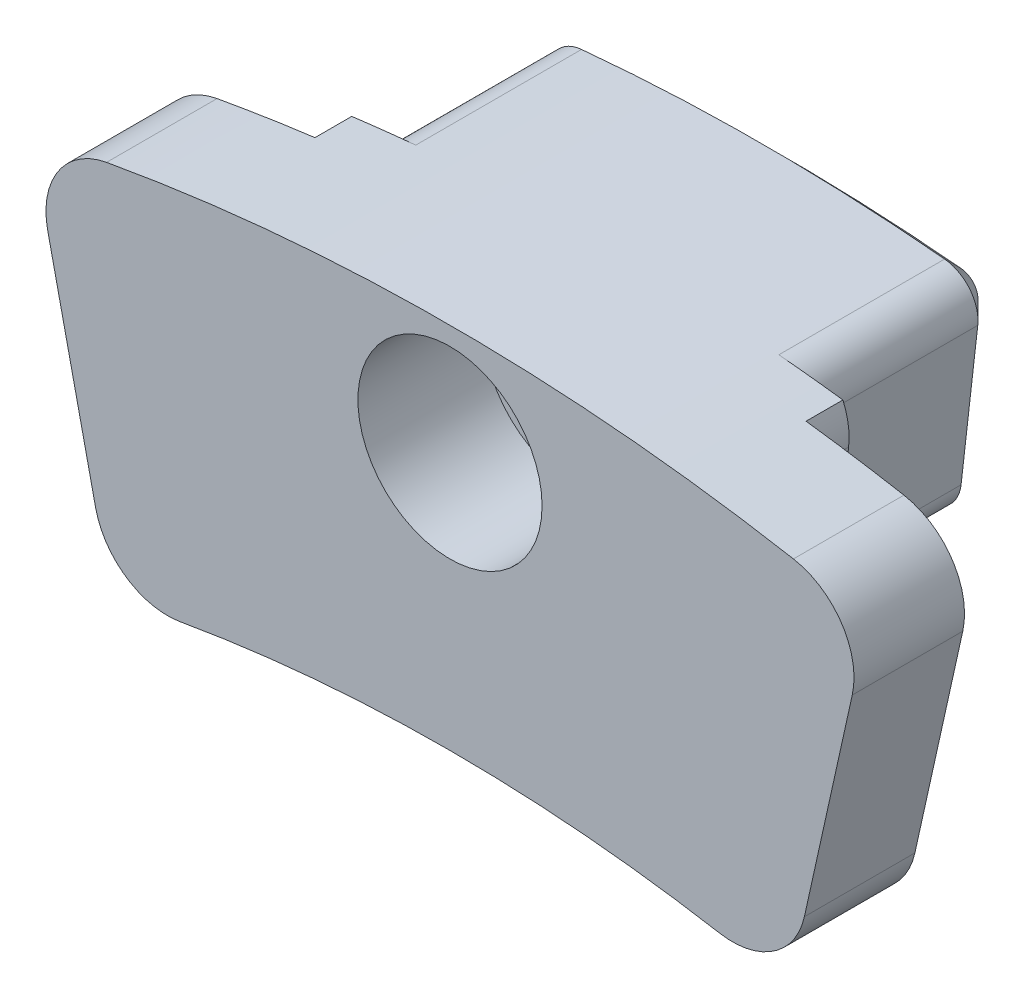
ISO-10303-21;
HEADER;
FILE_DESCRIPTION(('STEP AP214'),'2;1');
FILE_NAME('part.step','',(''),(''),'','','');
FILE_SCHEMA(('AUTOMOTIVE_DESIGN { 1 0 10303 214 1 1 1 1 }'));
ENDSEC;
DATA;
#1=APPLICATION_CONTEXT('core data for automotive mechanical design processes');
#2=APPLICATION_PROTOCOL_DEFINITION('international standard','automotive_design',2000,#1);
#3=PRODUCT_CONTEXT('',#1,'mechanical');
#4=PRODUCT('Part','Part','',(#3));
#5=PRODUCT_RELATED_PRODUCT_CATEGORY('part','',(#4));
#6=PRODUCT_DEFINITION_FORMATION('','',#4);
#7=PRODUCT_DEFINITION_CONTEXT('part definition',#1,'design');
#8=PRODUCT_DEFINITION('design','',#6,#7);
#9=PRODUCT_DEFINITION_SHAPE('','',#8);
#10=(LENGTH_UNIT() NAMED_UNIT(*) SI_UNIT(.MILLI.,.METRE.));
#11=(NAMED_UNIT(*) PLANE_ANGLE_UNIT() SI_UNIT($,.RADIAN.));
#12=(NAMED_UNIT(*) SI_UNIT($,.STERADIAN.) SOLID_ANGLE_UNIT());
#13=UNCERTAINTY_MEASURE_WITH_UNIT(LENGTH_MEASURE(1.E-05),#10,'distance_accuracy_value','');
#14=(GEOMETRIC_REPRESENTATION_CONTEXT(3) GLOBAL_UNCERTAINTY_ASSIGNED_CONTEXT((#13)) GLOBAL_UNIT_ASSIGNED_CONTEXT((#10,
#11,#12)) REPRESENTATION_CONTEXT('',''));
#15=CARTESIAN_POINT('',(0.,0.,0.));
#16=DIRECTION('',(0.,0.,1.));
#17=DIRECTION('',(1.,0.,0.));
#18=AXIS2_PLACEMENT_3D('',#15,#16,#17);
#19=CARTESIAN_POINT('',(0.,0.,6.));
#20=DIRECTION('',(0.,0.,1.));
#21=DIRECTION('',(1.,0.,0.));
#22=AXIS2_PLACEMENT_3D('',#19,#20,#21);
#23=PLANE('',#22);
#24=CARTESIAN_POINT('',(4.83529448942626,51.2725065429858,6.));
#25=DIRECTION('',(0.,0.,-1.));
#26=DIRECTION('',(-1.,0.,0.));
#27=AXIS2_PLACEMENT_3D('',#24,#25,#26);
#28=CIRCLE('',#27,1.99999999999999);
#29=CARTESIAN_POINT('',(6.66726855934589,52.0749222750986,6.));
#30=VERTEX_POINT('',#29);
#31=CARTESIAN_POINT('',(6.82243820077944,51.04610011545,6.));
#32=VERTEX_POINT('',#31);
#33=EDGE_CURVE('E480',#30,#32,#28,.T.);
#34=ORIENTED_EDGE('',*,*,#33,.F.);
#35=CARTESIAN_POINT('',(0.,0.,6.));
#36=DIRECTION('',(0.,0.,1.));
#37=DIRECTION('',(1.,0.,0.));
#38=AXIS2_PLACEMENT_3D('',#35,#36,#37);
#39=CIRCLE('',#38,52.5);
#40=CARTESIAN_POINT('',(9.32424249792701,51.6653510763244,6.));
#41=VERTEX_POINT('',#40);
#42=EDGE_CURVE('E271',#41,#30,#39,.T.);
#43=ORIENTED_EDGE('',*,*,#42,.F.);
#44=CARTESIAN_POINT('',(8.96903325991074,49.6971472257977,6.));
#45=DIRECTION('',(0.,0.,1.));
#46=DIRECTION('',(1.,0.,0.));
#47=AXIS2_PLACEMENT_3D('',#44,#45,#46);
#48=CIRCLE('',#47,2.);
#49=CARTESIAN_POINT('',(10.9216252741506,49.2642679979215,6.));
#50=VERTEX_POINT('',#49);
#51=EDGE_CURVE('E367',#41,#50,#48,.F.);
#52=ORIENTED_EDGE('',*,*,#51,.T.);
#53=DIRECTION('',(0.216439613938103,0.976296007119933,0.));
#54=VECTOR('',#53,1.);
#55=CARTESIAN_POINT('',(9.19868359236939,41.4925803025972,6.));
#56=LINE('',#55,#54);
#57=CARTESIAN_POINT('',(9.62183027985895,43.4012716641528,6.));
#58=VERTEX_POINT('',#57);
#59=EDGE_CURVE('E302',#58,#50,#56,.T.);
#60=ORIENTED_EDGE('',*,*,#59,.F.);
#61=CARTESIAN_POINT('',(7.66923826561909,43.834150892029,6.));
#62=DIRECTION('',(0.,0.,1.));
#63=DIRECTION('',(1.,0.,0.));
#64=AXIS2_PLACEMENT_3D('',#61,#62,#63);
#65=CIRCLE('',#64,2.);
#66=CARTESIAN_POINT('',(7.32455339974857,41.8640766946344,6.));
#67=VERTEX_POINT('',#66);
#68=EDGE_CURVE('E370',#58,#67,#65,.F.);
#69=ORIENTED_EDGE('',*,*,#68,.T.);
#70=CARTESIAN_POINT('',(0.,0.,6.));
#71=DIRECTION('',(0.,0.,-1.));
#72=DIRECTION('',(1.,0.,0.));
#73=AXIS2_PLACEMENT_3D('',#70,#71,#72);
#74=CIRCLE('',#73,42.5);
#75=CARTESIAN_POINT('',(-7.32455339974857,41.8640766946344,6.));
#76=VERTEX_POINT('',#75);
#77=EDGE_CURVE('E321',#76,#67,#74,.T.);
#78=ORIENTED_EDGE('',*,*,#77,.F.);
#79=CARTESIAN_POINT('',(-7.66923826561909,43.834150892029,6.));
#80=DIRECTION('',(0.,0.,1.));
#81=DIRECTION('',(1.,0.,0.));
#82=AXIS2_PLACEMENT_3D('',#79,#80,#81);
#83=CIRCLE('',#82,2.);
#84=CARTESIAN_POINT('',(-9.62183027985895,43.4012716641528,6.));
#85=VERTEX_POINT('',#84);
#86=EDGE_CURVE('E364',#76,#85,#83,.F.);
#87=ORIENTED_EDGE('',*,*,#86,.T.);
#88=DIRECTION('',(0.216439613938103,-0.976296007119933,0.));
#89=VECTOR('',#88,1.);
#90=CARTESIAN_POINT('',(-9.19868359236939,41.4925803025972,6.));
#91=LINE('',#90,#89);
#92=CARTESIAN_POINT('',(-10.9216252741506,49.2642679979215,6.));
#93=VERTEX_POINT('',#92);
#94=EDGE_CURVE('E317',#93,#85,#91,.T.);
#95=ORIENTED_EDGE('',*,*,#94,.F.);
#96=CARTESIAN_POINT('',(-8.96903325991074,49.6971472257977,6.));
#97=DIRECTION('',(0.,0.,1.));
#98=DIRECTION('',(1.,0.,0.));
#99=AXIS2_PLACEMENT_3D('',#96,#97,#98);
#100=CIRCLE('',#99,2.);
#101=CARTESIAN_POINT('',(-9.32424249792701,51.6653510763244,6.));
#102=VERTEX_POINT('',#101);
#103=EDGE_CURVE('E360',#93,#102,#100,.F.);
#104=ORIENTED_EDGE('',*,*,#103,.T.);
#105=CARTESIAN_POINT('',(-6.66726855934591,52.0749222750986,6.));
#106=VERTEX_POINT('',#105);
#107=EDGE_CURVE('E296',#106,#102,#39,.T.);
#108=ORIENTED_EDGE('',*,*,#107,.F.);
#109=CARTESIAN_POINT('',(-4.83529448942626,51.2725065429858,6.));
#110=DIRECTION('',(0.,0.,-1.));
#111=DIRECTION('',(-1.,0.,0.));
#112=AXIS2_PLACEMENT_3D('',#109,#110,#111);
#113=CIRCLE('',#112,2.);
#114=CARTESIAN_POINT('',(-6.82243820077944,51.04610011545,6.));
#115=VERTEX_POINT('',#114);
#116=EDGE_CURVE('E265',#115,#106,#113,.T.);
#117=ORIENTED_EDGE('',*,*,#116,.F.);
#118=DIRECTION('',(-0.113203213767908,0.993571855676587,0.));
#119=VECTOR('',#118,1.);
#120=CARTESIAN_POINT('',(-6.36953276481174,47.0710001206474,6.));
#121=LINE('',#120,#119);
#122=CARTESIAN_POINT('',(-6.36953276481174,47.0710001206474,6.));
#123=VERTEX_POINT('',#122);
#124=EDGE_CURVE('E504',#123,#115,#121,.T.);
#125=ORIENTED_EDGE('',*,*,#124,.F.);
#126=CARTESIAN_POINT('',(-4.38238905345856,47.2974065481832,6.));
#127=DIRECTION('',(0.,0.,-1.));
#128=DIRECTION('',(-1.,0.,0.));
#129=AXIS2_PLACEMENT_3D('',#126,#127,#128);
#130=CIRCLE('',#129,2.);
#131=CARTESIAN_POINT('',(-4.1978674091024,45.305936798786,6.));
#132=VERTEX_POINT('',#131);
#133=EDGE_CURVE('E501',#132,#123,#130,.T.);
#134=ORIENTED_EDGE('',*,*,#133,.F.);
#135=CARTESIAN_POINT('',(0.,0.,6.));
#136=DIRECTION('',(0.,0.,1.));
#137=DIRECTION('',(-1.,0.,0.));
#138=AXIS2_PLACEMENT_3D('',#135,#136,#137);
#139=CIRCLE('',#138,45.5);
#140=CARTESIAN_POINT('',(4.19786740910241,45.305936798786,6.));
#141=VERTEX_POINT('',#140);
#142=EDGE_CURVE('E498',#141,#132,#139,.T.);
#143=ORIENTED_EDGE('',*,*,#142,.F.);
#144=CARTESIAN_POINT('',(4.38238905345856,47.2974065481832,6.));
#145=DIRECTION('',(0.,0.,-1.));
#146=DIRECTION('',(-1.,0.,0.));
#147=AXIS2_PLACEMENT_3D('',#144,#145,#146);
#148=CIRCLE('',#147,2.);
#149=CARTESIAN_POINT('',(6.36953276481174,47.0710001206474,6.));
#150=VERTEX_POINT('',#149);
#151=EDGE_CURVE('E491',#150,#141,#148,.T.);
#152=ORIENTED_EDGE('',*,*,#151,.F.);
#153=DIRECTION('',(-0.113203213767906,-0.993571855676587,0.));
#154=VECTOR('',#153,1.);
#155=CARTESIAN_POINT('',(6.82243820077944,51.04610011545,6.));
#156=LINE('',#155,#154);
#157=EDGE_CURVE('E487',#32,#150,#156,.T.);
#158=ORIENTED_EDGE('',*,*,#157,.F.);
#159=EDGE_LOOP('',(#34,#43,#52,#60,#69,#78,#87,#95,#104,#108,#117,#125,#134,#143,#152,#158));
#160=FACE_BOUND('',#159,.T.);
#161=ADVANCED_FACE('F54',(#160),#23,.F.);
#162=CARTESIAN_POINT('',(0.,0.,6.));
#163=DIRECTION('',(0.,0.,-1.));
#164=DIRECTION('',(-1.,0.,0.));
#165=AXIS2_PLACEMENT_3D('',#162,#163,#164);
#166=CYLINDRICAL_SURFACE('',#165,52.5);
#167=DIRECTION('',(0.,0.,-1.));
#168=VECTOR('',#167,1.);
#169=CARTESIAN_POINT('',(4.92918370281318,52.268089194306,6.));
#170=LINE('',#169,#168);
#171=CARTESIAN_POINT('',(4.92918370281318,52.2680891943059,5.));
#172=VERTEX_POINT('',#171);
#173=CARTESIAN_POINT('',(4.92918370281318,52.268089194306,0.500000000000007));
#174=VERTEX_POINT('',#173);
#175=EDGE_CURVE('E350',#172,#174,#170,.T.);
#176=ORIENTED_EDGE('',*,*,#175,.T.);
#177=CARTESIAN_POINT('',(0.,0.,0.500000000000007));
#178=DIRECTION('',(0.,0.,1.));
#179=DIRECTION('',(1.,0.,0.));
#180=AXIS2_PLACEMENT_3D('',#177,#178,#179);
#181=CIRCLE('',#180,52.5);
#182=CARTESIAN_POINT('',(-4.92918370281318,52.268089194306,0.500000000000007));
#183=VERTEX_POINT('',#182);
#184=EDGE_CURVE('E405',#174,#183,#181,.T.);
#185=ORIENTED_EDGE('',*,*,#184,.T.);
#186=DIRECTION('',(0.,0.,-1.));
#187=VECTOR('',#186,1.);
#188=CARTESIAN_POINT('',(-4.92918370281318,52.268089194306,6.));
#189=LINE('',#188,#187);
#190=CARTESIAN_POINT('',(-4.92918370281318,52.2680891943059,5.));
#191=VERTEX_POINT('',#190);
#192=EDGE_CURVE('E347',#183,#191,#189,.F.);
#193=ORIENTED_EDGE('',*,*,#192,.T.);
#194=CARTESIAN_POINT('',(0.,0.,5.));
#195=DIRECTION('',(0.,0.,-1.));
#196=DIRECTION('',(-1.,0.,0.));
#197=AXIS2_PLACEMENT_3D('',#194,#195,#196);
#198=CIRCLE('',#197,52.5);
#199=CARTESIAN_POINT('',(-6.66726855934591,52.0749222750986,5.));
#200=VERTEX_POINT('',#199);
#201=EDGE_CURVE('E568',#200,#191,#198,.T.);
#202=ORIENTED_EDGE('',*,*,#201,.F.);
#203=DIRECTION('',(0.,0.,1.));
#204=VECTOR('',#203,1.);
#205=CARTESIAN_POINT('',(-6.66726855934591,52.0749222750986,5.));
#206=LINE('',#205,#204);
#207=EDGE_CURVE('E510',#200,#106,#206,.T.);
#208=ORIENTED_EDGE('',*,*,#207,.T.);
#209=ORIENTED_EDGE('',*,*,#107,.T.);
#210=DIRECTION('',(0.,0.,-1.));
#211=VECTOR('',#210,1.);
#212=CARTESIAN_POINT('',(-9.32424249792701,51.6653510763244,6.));
#213=LINE('',#212,#211);
#214=CARTESIAN_POINT('',(-9.32424249792701,51.6653510763244,9.));
#215=VERTEX_POINT('',#214);
#216=EDGE_CURVE('E392',#102,#215,#213,.F.);
#217=ORIENTED_EDGE('',*,*,#216,.T.);
#218=CARTESIAN_POINT('',(0.,0.,9.));
#219=DIRECTION('',(0.,0.,1.));
#220=DIRECTION('',(1.,0.,0.));
#221=AXIS2_PLACEMENT_3D('',#218,#219,#220);
#222=CIRCLE('',#221,52.5);
#223=CARTESIAN_POINT('',(9.32424249792701,51.6653510763244,9.));
#224=VERTEX_POINT('',#223);
#225=EDGE_CURVE('E297',#224,#215,#222,.T.);
#226=ORIENTED_EDGE('',*,*,#225,.F.);
#227=DIRECTION('',(0.,0.,-1.));
#228=VECTOR('',#227,1.);
#229=CARTESIAN_POINT('',(9.32424249792701,51.6653510763244,6.));
#230=LINE('',#229,#228);
#231=EDGE_CURVE('E395',#224,#41,#230,.T.);
#232=ORIENTED_EDGE('',*,*,#231,.T.);
#233=ORIENTED_EDGE('',*,*,#42,.T.);
#234=DIRECTION('',(0.,0.,1.));
#235=VECTOR('',#234,1.);
#236=CARTESIAN_POINT('',(6.66726855934589,52.0749222750986,5.));
#237=LINE('',#236,#235);
#238=CARTESIAN_POINT('',(6.66726855934589,52.0749222750986,5.));
#239=VERTEX_POINT('',#238);
#240=EDGE_CURVE('E246',#239,#30,#237,.T.);
#241=ORIENTED_EDGE('',*,*,#240,.F.);
#242=CARTESIAN_POINT('',(0.,0.,5.));
#243=DIRECTION('',(0.,0.,-1.));
#244=DIRECTION('',(-1.,0.,0.));
#245=AXIS2_PLACEMENT_3D('',#242,#243,#244);
#246=CIRCLE('',#245,52.5);
#247=EDGE_CURVE('E254',#172,#239,#246,.T.);
#248=ORIENTED_EDGE('',*,*,#247,.F.);
#249=EDGE_LOOP('',(#176,#185,#193,#202,#208,#209,#217,#226,#232,#233,#241,#248));
#250=FACE_BOUND('',#249,.T.);
#251=ADVANCED_FACE('F268',(#250),#166,.T.);
#252=CARTESIAN_POINT('',(-5.26394944020767,46.2010912889613,6.));
#253=DIRECTION('',(0.993571855676587,0.113203213767907,0.));
#254=DIRECTION('',(-0.113203213767907,0.993571855676587,0.));
#255=AXIS2_PLACEMENT_3D('',#252,#253,#254);
#256=PLANE('',#255);
#257=DIRECTION('',(0.,0.,-1.));
#258=VECTOR('',#257,1.);
#259=CARTESIAN_POINT('',(-5.82886634510285,51.1593033292179,6.));
#260=LINE('',#259,#258);
#261=CARTESIAN_POINT('',(-5.82886634510285,51.1593033292179,5.));
#262=VERTEX_POINT('',#261);
#263=CARTESIAN_POINT('',(-5.82886634510285,51.1593033292179,0.500000000000007));
#264=VERTEX_POINT('',#263);
#265=EDGE_CURVE('E333',#262,#264,#260,.T.);
#266=ORIENTED_EDGE('',*,*,#265,.T.);
#267=DIRECTION('',(0.113203213767907,-0.993571855676587,0.));
#268=VECTOR('',#267,1.);
#269=CARTESIAN_POINT('',(-5.26394944020767,46.2010912889613,0.500000000000007));
#270=LINE('',#269,#268);
#271=CARTESIAN_POINT('',(-5.37596090913515,47.1842033344153,0.500000000000007));
#272=VERTEX_POINT('',#271);
#273=EDGE_CURVE('E440',#264,#272,#270,.T.);
#274=ORIENTED_EDGE('',*,*,#273,.T.);
#275=DIRECTION('',(0.,0.,-1.));
#276=VECTOR('',#275,1.);
#277=CARTESIAN_POINT('',(-5.37596090913515,47.1842033344153,6.));
#278=LINE('',#277,#276);
#279=CARTESIAN_POINT('',(-5.37596090913515,47.1842033344153,5.));
#280=VERTEX_POINT('',#279);
#281=EDGE_CURVE('E337',#272,#280,#278,.F.);
#282=ORIENTED_EDGE('',*,*,#281,.T.);
#283=DIRECTION('',(0.113203213767907,-0.993571855676587,0.));
#284=VECTOR('',#283,1.);
#285=CARTESIAN_POINT('',(-5.82886634510285,51.1593033292179,5.));
#286=LINE('',#285,#284);
#287=EDGE_CURVE('E575',#262,#280,#286,.T.);
#288=ORIENTED_EDGE('',*,*,#287,.F.);
#289=EDGE_LOOP('',(#266,#274,#282,#288));
#290=FACE_BOUND('',#289,.T.);
#291=ADVANCED_FACE('F629',(#290),#256,.F.);
#292=CARTESIAN_POINT('',(0.,0.,6.));
#293=DIRECTION('',(0.,0.,-1.));
#294=DIRECTION('',(-1.,0.,0.));
#295=AXIS2_PLACEMENT_3D('',#292,#293,#294);
#296=CYLINDRICAL_SURFACE('',#295,46.5);
#297=DIRECTION('',(0.,0.,-1.));
#298=VECTOR('',#297,1.);
#299=CARTESIAN_POINT('',(-4.29012823128049,46.3016716734846,6.));
#300=LINE('',#299,#298);
#301=CARTESIAN_POINT('',(-4.29012823128048,46.3016716734846,5.));
#302=VERTEX_POINT('',#301);
#303=CARTESIAN_POINT('',(-4.29012823128049,46.3016716734846,0.500000000000007));
#304=VERTEX_POINT('',#303);
#305=EDGE_CURVE('E330',#302,#304,#300,.T.);
#306=ORIENTED_EDGE('',*,*,#305,.T.);
#307=CARTESIAN_POINT('',(0.,0.,0.500000000000007));
#308=DIRECTION('',(0.,0.,1.));
#309=DIRECTION('',(1.,0.,0.));
#310=AXIS2_PLACEMENT_3D('',#307,#308,#309);
#311=CIRCLE('',#310,46.5);
#312=CARTESIAN_POINT('',(4.29012823128049,46.3016716734846,0.500000000000007));
#313=VERTEX_POINT('',#312);
#314=EDGE_CURVE('E13',#304,#313,#311,.F.);
#315=ORIENTED_EDGE('',*,*,#314,.T.);
#316=DIRECTION('',(0.,0.,-1.));
#317=VECTOR('',#316,1.);
#318=CARTESIAN_POINT('',(4.29012823128049,46.3016716734846,6.));
#319=LINE('',#318,#317);
#320=CARTESIAN_POINT('',(4.29012823128049,46.3016716734846,5.));
#321=VERTEX_POINT('',#320);
#322=EDGE_CURVE('E314',#313,#321,#319,.F.);
#323=ORIENTED_EDGE('',*,*,#322,.T.);
#324=CARTESIAN_POINT('',(0.,0.,5.));
#325=DIRECTION('',(0.,0.,-1.));
#326=DIRECTION('',(-1.,0.,0.));
#327=AXIS2_PLACEMENT_3D('',#324,#325,#326);
#328=CIRCLE('',#327,46.5);
#329=EDGE_CURVE('E582',#302,#321,#328,.T.);
#330=ORIENTED_EDGE('',*,*,#329,.F.);
#331=EDGE_LOOP('',(#306,#315,#323,#330));
#332=FACE_BOUND('',#331,.T.);
#333=ADVANCED_FACE('F685',(#332),#296,.F.);
#334=CARTESIAN_POINT('',(5.26394944020767,46.2010912889613,6.));
#335=DIRECTION('',(-0.993571855676587,0.113203213767907,0.));
#336=DIRECTION('',(-0.113203213767907,-0.993571855676587,0.));
#337=AXIS2_PLACEMENT_3D('',#334,#335,#336);
#338=PLANE('',#337);
#339=DIRECTION('',(0.,0.,-1.));
#340=VECTOR('',#339,1.);
#341=CARTESIAN_POINT('',(5.37596090913515,47.1842033344153,6.));
#342=LINE('',#341,#340);
#343=CARTESIAN_POINT('',(5.37596090913515,47.1842033344153,5.));
#344=VERTEX_POINT('',#343);
#345=CARTESIAN_POINT('',(5.37596090913515,47.1842033344153,0.500000000000007));
#346=VERTEX_POINT('',#345);
#347=EDGE_CURVE('E343',#344,#346,#342,.T.);
#348=ORIENTED_EDGE('',*,*,#347,.T.);
#349=DIRECTION('',(0.113203213767907,0.993571855676587,0.));
#350=VECTOR('',#349,1.);
#351=CARTESIAN_POINT('',(5.26394944020767,46.2010912889613,0.500000000000007));
#352=LINE('',#351,#350);
#353=CARTESIAN_POINT('',(5.82886634510285,51.1593033292179,0.500000000000007));
#354=VERTEX_POINT('',#353);
#355=EDGE_CURVE('E443',#346,#354,#352,.T.);
#356=ORIENTED_EDGE('',*,*,#355,.T.);
#357=DIRECTION('',(0.,0.,-1.));
#358=VECTOR('',#357,1.);
#359=CARTESIAN_POINT('',(5.82886634510285,51.1593033292179,6.));
#360=LINE('',#359,#358);
#361=CARTESIAN_POINT('',(5.82886634510286,51.1593033292179,5.));
#362=VERTEX_POINT('',#361);
#363=EDGE_CURVE('E340',#354,#362,#360,.F.);
#364=ORIENTED_EDGE('',*,*,#363,.T.);
#365=DIRECTION('',(0.113203213767907,0.993571855676587,0.));
#366=VECTOR('',#365,1.);
#367=CARTESIAN_POINT('',(5.37596090913515,47.1842033344153,5.));
#368=LINE('',#367,#366);
#369=EDGE_CURVE('E588',#344,#362,#368,.T.);
#370=ORIENTED_EDGE('',*,*,#369,.F.);
#371=EDGE_LOOP('',(#348,#356,#364,#370));
#372=FACE_BOUND('',#371,.T.);
#373=ADVANCED_FACE('F645',(#372),#338,.F.);
#374=CARTESIAN_POINT('',(0.,0.,0.));
#375=DIRECTION('',(0.,0.,1.));
#376=DIRECTION('',(1.,0.,0.));
#377=AXIS2_PLACEMENT_3D('',#374,#375,#376);
#378=PLANE('',#377);
#379=CARTESIAN_POINT('',(-4.83529448942626,51.2725065429858,0.));
#380=DIRECTION('',(0.,0.,1.));
#381=DIRECTION('',(1.,0.,0.));
#382=AXIS2_PLACEMENT_3D('',#379,#380,#381);
#383=CIRCLE('',#382,0.500000000000002);
#384=CARTESIAN_POINT('',(-5.33208041726455,51.2159049361019,0.));
#385=VERTEX_POINT('',#384);
#386=CARTESIAN_POINT('',(-4.88223909611972,51.7702978686459,0.));
#387=VERTEX_POINT('',#386);
#388=EDGE_CURVE('E427',#385,#387,#383,.F.);
#389=ORIENTED_EDGE('',*,*,#388,.T.);
#390=CARTESIAN_POINT('',(0.,0.,0.));
#391=DIRECTION('',(0.,0.,1.));
#392=DIRECTION('',(1.,0.,0.));
#393=AXIS2_PLACEMENT_3D('',#390,#391,#392);
#394=CIRCLE('',#393,52.);
#395=CARTESIAN_POINT('',(4.88223909611972,51.7702978686459,0.));
#396=VERTEX_POINT('',#395);
#397=EDGE_CURVE('E430',#387,#396,#394,.F.);
#398=ORIENTED_EDGE('',*,*,#397,.T.);
#399=CARTESIAN_POINT('',(4.83529448942626,51.2725065429858,0.));
#400=DIRECTION('',(0.,0.,1.));
#401=DIRECTION('',(1.,0.,0.));
#402=AXIS2_PLACEMENT_3D('',#399,#400,#401);
#403=CIRCLE('',#402,0.499999999999999);
#404=CARTESIAN_POINT('',(5.33208041726455,51.2159049361019,0.));
#405=VERTEX_POINT('',#404);
#406=EDGE_CURVE('E424',#396,#405,#403,.F.);
#407=ORIENTED_EDGE('',*,*,#406,.T.);
#408=DIRECTION('',(-0.113203213767907,-0.993571855676587,0.));
#409=VECTOR('',#408,1.);
#410=CARTESIAN_POINT('',(-0.496785927838296,0.0566016068839537,0.));
#411=LINE('',#410,#409);
#412=CARTESIAN_POINT('',(4.87917498129685,47.2408049412993,0.));
#413=VERTEX_POINT('',#412);
#414=EDGE_CURVE('E418',#405,#413,#411,.T.);
#415=ORIENTED_EDGE('',*,*,#414,.T.);
#416=CARTESIAN_POINT('',(4.38238905345856,47.2974065481832,0.));
#417=DIRECTION('',(0.,0.,1.));
#418=DIRECTION('',(1.,0.,0.));
#419=AXIS2_PLACEMENT_3D('',#416,#417,#418);
#420=CIRCLE('',#419,0.499999999999997);
#421=CARTESIAN_POINT('',(4.33625864236952,46.7995391108339,0.));
#422=VERTEX_POINT('',#421);
#423=EDGE_CURVE('E412',#413,#422,#420,.F.);
#424=ORIENTED_EDGE('',*,*,#423,.T.);
#425=CARTESIAN_POINT('',(0.,0.,0.));
#426=DIRECTION('',(0.,0.,1.));
#427=DIRECTION('',(1.,0.,0.));
#428=AXIS2_PLACEMENT_3D('',#425,#426,#427);
#429=CIRCLE('',#428,47.);
#430=CARTESIAN_POINT('',(-4.33625864236952,46.7995391108339,0.));
#431=VERTEX_POINT('',#430);
#432=EDGE_CURVE('E409',#422,#431,#429,.T.);
#433=ORIENTED_EDGE('',*,*,#432,.T.);
#434=CARTESIAN_POINT('',(-4.38238905345856,47.2974065481832,0.));
#435=DIRECTION('',(0.,0.,1.));
#436=DIRECTION('',(1.,0.,0.));
#437=AXIS2_PLACEMENT_3D('',#434,#435,#436);
#438=CIRCLE('',#437,0.499999999999999);
#439=CARTESIAN_POINT('',(-4.87917498129686,47.2408049412993,0.));
#440=VERTEX_POINT('',#439);
#441=EDGE_CURVE('E415',#431,#440,#438,.F.);
#442=ORIENTED_EDGE('',*,*,#441,.T.);
#443=DIRECTION('',(-0.113203213767907,0.993571855676587,0.));
#444=VECTOR('',#443,1.);
#445=CARTESIAN_POINT('',(0.496785927838295,0.0566016068839536,0.));
#446=LINE('',#445,#444);
#447=EDGE_CURVE('E421',#440,#385,#446,.T.);
#448=ORIENTED_EDGE('',*,*,#447,.T.);
#449=EDGE_LOOP('',(#389,#398,#407,#415,#424,#433,#442,#448));
#450=FACE_BOUND('',#449,.T.);
#451=CARTESIAN_POINT('',(0.,49.5,0.));
#452=DIRECTION('',(0.,0.,1.));
#453=DIRECTION('',(1.,0.,0.));
#454=AXIS2_PLACEMENT_3D('',#451,#452,#453);
#455=CIRCLE('',#454,1.7);
#456=CARTESIAN_POINT('',(1.7,49.5,0.));
#457=VERTEX_POINT('',#456);
#458=EDGE_CURVE('E292',#457,#457,#455,.T.);
#459=ORIENTED_EDGE('',*,*,#458,.T.);
#460=EDGE_LOOP('',(#459));
#461=FACE_BOUND('',#460,.T.);
#462=ADVANCED_FACE('F636',(#450,#461),#378,.F.);
#463=CARTESIAN_POINT('',(-4.38238905345856,47.2974065481832,6.));
#464=DIRECTION('',(0.,0.,-1.));
#465=DIRECTION('',(-1.,0.,0.));
#466=AXIS2_PLACEMENT_3D('',#463,#464,#465);
#467=CYLINDRICAL_SURFACE('',#466,1.);
#468=ORIENTED_EDGE('',*,*,#281,.F.);
#469=CARTESIAN_POINT('',(-4.38238905345856,47.2974065481832,0.500000000000007));
#470=DIRECTION('',(0.,0.,1.));
#471=DIRECTION('',(1.,0.,0.));
#472=AXIS2_PLACEMENT_3D('',#469,#470,#471);
#473=CIRCLE('',#472,1.);
#474=EDGE_CURVE('E79',#272,#304,#473,.T.);
#475=ORIENTED_EDGE('',*,*,#474,.T.);
#476=ORIENTED_EDGE('',*,*,#305,.F.);
#477=CARTESIAN_POINT('',(-4.38238905345856,47.2974065481832,5.));
#478=DIRECTION('',(0.,0.,1.));
#479=DIRECTION('',(-1.,0.,0.));
#480=AXIS2_PLACEMENT_3D('',#477,#478,#479);
#481=CIRCLE('',#480,1.);
#482=EDGE_CURVE('E579',#280,#302,#481,.T.);
#483=ORIENTED_EDGE('',*,*,#482,.F.);
#484=EDGE_LOOP('',(#468,#475,#476,#483));
#485=FACE_BOUND('',#484,.T.);
#486=ADVANCED_FACE('F682',(#485),#467,.T.);
#487=CARTESIAN_POINT('',(4.38238905345856,47.2974065481832,6.));
#488=DIRECTION('',(0.,0.,-1.));
#489=DIRECTION('',(-1.,0.,0.));
#490=AXIS2_PLACEMENT_3D('',#487,#488,#489);
#491=CYLINDRICAL_SURFACE('',#490,1.);
#492=ORIENTED_EDGE('',*,*,#322,.F.);
#493=CARTESIAN_POINT('',(4.38238905345856,47.2974065481832,0.500000000000007));
#494=DIRECTION('',(0.,0.,1.));
#495=DIRECTION('',(1.,0.,0.));
#496=AXIS2_PLACEMENT_3D('',#493,#494,#495);
#497=CIRCLE('',#496,1.);
#498=EDGE_CURVE('E65',#313,#346,#497,.T.);
#499=ORIENTED_EDGE('',*,*,#498,.T.);
#500=ORIENTED_EDGE('',*,*,#347,.F.);
#501=CARTESIAN_POINT('',(4.38238905345856,47.2974065481832,5.));
#502=DIRECTION('',(0.,0.,1.));
#503=DIRECTION('',(-1.,0.,0.));
#504=AXIS2_PLACEMENT_3D('',#501,#502,#503);
#505=CIRCLE('',#504,1.);
#506=EDGE_CURVE('E586',#321,#344,#505,.T.);
#507=ORIENTED_EDGE('',*,*,#506,.F.);
#508=EDGE_LOOP('',(#492,#499,#500,#507));
#509=FACE_BOUND('',#508,.T.);
#510=ADVANCED_FACE('F644',(#509),#491,.T.);
#511=CARTESIAN_POINT('',(4.83529448942626,51.2725065429858,6.));
#512=DIRECTION('',(0.,0.,-1.));
#513=DIRECTION('',(-1.,0.,0.));
#514=AXIS2_PLACEMENT_3D('',#511,#512,#513);
#515=CYLINDRICAL_SURFACE('',#514,1.);
#516=ORIENTED_EDGE('',*,*,#363,.F.);
#517=CARTESIAN_POINT('',(4.83529448942626,51.2725065429858,0.500000000000007));
#518=DIRECTION('',(0.,0.,1.));
#519=DIRECTION('',(1.,0.,0.));
#520=AXIS2_PLACEMENT_3D('',#517,#518,#519);
#521=CIRCLE('',#520,1.);
#522=EDGE_CURVE('E437',#354,#174,#521,.T.);
#523=ORIENTED_EDGE('',*,*,#522,.T.);
#524=ORIENTED_EDGE('',*,*,#175,.F.);
#525=CARTESIAN_POINT('',(4.83529448942626,51.2725065429858,5.));
#526=DIRECTION('',(0.,0.,1.));
#527=DIRECTION('',(-1.,0.,0.));
#528=AXIS2_PLACEMENT_3D('',#525,#526,#527);
#529=CIRCLE('',#528,1.00000000000001);
#530=EDGE_CURVE('E260',#362,#172,#529,.T.);
#531=ORIENTED_EDGE('',*,*,#530,.F.);
#532=EDGE_LOOP('',(#516,#523,#524,#531));
#533=FACE_BOUND('',#532,.T.);
#534=ADVANCED_FACE('F604',(#533),#515,.T.);
#535=CARTESIAN_POINT('',(-4.83529448942626,51.2725065429858,6.));
#536=DIRECTION('',(0.,0.,-1.));
#537=DIRECTION('',(-1.,0.,0.));
#538=AXIS2_PLACEMENT_3D('',#535,#536,#537);
#539=CYLINDRICAL_SURFACE('',#538,1.);
#540=ORIENTED_EDGE('',*,*,#192,.F.);
#541=CARTESIAN_POINT('',(-4.83529448942626,51.2725065429858,0.500000000000007));
#542=DIRECTION('',(0.,0.,1.));
#543=DIRECTION('',(1.,0.,0.));
#544=AXIS2_PLACEMENT_3D('',#541,#542,#543);
#545=CIRCLE('',#544,1.);
#546=EDGE_CURVE('E434',#183,#264,#545,.T.);
#547=ORIENTED_EDGE('',*,*,#546,.T.);
#548=ORIENTED_EDGE('',*,*,#265,.F.);
#549=CARTESIAN_POINT('',(-4.83529448942626,51.2725065429858,5.));
#550=DIRECTION('',(0.,0.,1.));
#551=DIRECTION('',(-1.,0.,0.));
#552=AXIS2_PLACEMENT_3D('',#549,#550,#551);
#553=CIRCLE('',#552,1.00000000000001);
#554=EDGE_CURVE('E572',#191,#262,#553,.T.);
#555=ORIENTED_EDGE('',*,*,#554,.F.);
#556=EDGE_LOOP('',(#540,#547,#548,#555));
#557=FACE_BOUND('',#556,.T.);
#558=ADVANCED_FACE('F624',(#557),#539,.T.);
#559=CARTESIAN_POINT('',(-9.19868359236939,41.4925803025972,9.));
#560=DIRECTION('',(0.976296007119933,0.216439613938103,0.));
#561=DIRECTION('',(-0.216439613938103,0.976296007119933,0.));
#562=AXIS2_PLACEMENT_3D('',#559,#560,#561);
#563=PLANE('',#562);
#564=ORIENTED_EDGE('',*,*,#94,.T.);
#565=DIRECTION('',(0.,0.,-1.));
#566=VECTOR('',#565,1.);
#567=CARTESIAN_POINT('',(-9.62183027985895,43.4012716641528,9.));
#568=LINE('',#567,#566);
#569=CARTESIAN_POINT('',(-9.62183027985895,43.4012716641528,9.));
#570=VERTEX_POINT('',#569);
#571=EDGE_CURVE('E402',#85,#570,#568,.F.);
#572=ORIENTED_EDGE('',*,*,#571,.T.);
#573=DIRECTION('',(0.216439613938103,-0.976296007119933,0.));
#574=VECTOR('',#573,1.);
#575=CARTESIAN_POINT('',(-9.19868359236939,41.4925803025972,9.));
#576=LINE('',#575,#574);
#577=CARTESIAN_POINT('',(-10.9216252741506,49.2642679979215,9.));
#578=VERTEX_POINT('',#577);
#579=EDGE_CURVE('E301',#578,#570,#576,.T.);
#580=ORIENTED_EDGE('',*,*,#579,.F.);
#581=DIRECTION('',(0.,0.,-1.));
#582=VECTOR('',#581,1.);
#583=CARTESIAN_POINT('',(-10.9216252741506,49.2642679979215,9.));
#584=LINE('',#583,#582);
#585=EDGE_CURVE('E398',#578,#93,#584,.T.);
#586=ORIENTED_EDGE('',*,*,#585,.T.);
#587=EDGE_LOOP('',(#564,#572,#580,#586));
#588=FACE_BOUND('',#587,.T.);
#589=ADVANCED_FACE('F675',(#588),#563,.F.);
#590=CARTESIAN_POINT('',(0.,0.,9.));
#591=DIRECTION('',(0.,0.,-1.));
#592=DIRECTION('',(-1.,0.,0.));
#593=AXIS2_PLACEMENT_3D('',#590,#591,#592);
#594=CYLINDRICAL_SURFACE('',#593,42.5);
#595=ORIENTED_EDGE('',*,*,#77,.T.);
#596=DIRECTION('',(0.,0.,-1.));
#597=VECTOR('',#596,1.);
#598=CARTESIAN_POINT('',(7.32455339974857,41.8640766946344,9.));
#599=LINE('',#598,#597);
#600=CARTESIAN_POINT('',(7.32455339974857,41.8640766946344,9.));
#601=VERTEX_POINT('',#600);
#602=EDGE_CURVE('E377',#67,#601,#599,.F.);
#603=ORIENTED_EDGE('',*,*,#602,.T.);
#604=CARTESIAN_POINT('',(0.,0.,9.));
#605=DIRECTION('',(0.,0.,-1.));
#606=DIRECTION('',(1.,0.,0.));
#607=AXIS2_PLACEMENT_3D('',#604,#605,#606);
#608=CIRCLE('',#607,42.5);
#609=CARTESIAN_POINT('',(-7.32455339974857,41.8640766946344,9.));
#610=VERTEX_POINT('',#609);
#611=EDGE_CURVE('E306',#610,#601,#608,.T.);
#612=ORIENTED_EDGE('',*,*,#611,.F.);
#613=DIRECTION('',(0.,0.,-1.));
#614=VECTOR('',#613,1.);
#615=CARTESIAN_POINT('',(-7.32455339974857,41.8640766946344,9.));
#616=LINE('',#615,#614);
#617=EDGE_CURVE('E373',#610,#76,#616,.T.);
#618=ORIENTED_EDGE('',*,*,#617,.T.);
#619=EDGE_LOOP('',(#595,#603,#612,#618));
#620=FACE_BOUND('',#619,.T.);
#621=ADVANCED_FACE('F671',(#620),#594,.F.);
#622=CARTESIAN_POINT('',(9.19868359236939,41.4925803025972,9.));
#623=DIRECTION('',(-0.976296007119933,0.216439613938103,0.));
#624=DIRECTION('',(-0.216439613938103,-0.976296007119933,0.));
#625=AXIS2_PLACEMENT_3D('',#622,#623,#624);
#626=PLANE('',#625);
#627=DIRECTION('',(0.216439613938103,0.976296007119933,0.));
#628=VECTOR('',#627,1.);
#629=CARTESIAN_POINT('',(9.19868359236939,41.4925803025972,9.));
#630=LINE('',#629,#628);
#631=CARTESIAN_POINT('',(9.62183027985895,43.4012716641528,9.));
#632=VERTEX_POINT('',#631);
#633=CARTESIAN_POINT('',(10.9216252741506,49.2642679979215,9.));
#634=VERTEX_POINT('',#633);
#635=EDGE_CURVE('E310',#632,#634,#630,.T.);
#636=ORIENTED_EDGE('',*,*,#635,.F.);
#637=DIRECTION('',(0.,0.,-1.));
#638=VECTOR('',#637,1.);
#639=CARTESIAN_POINT('',(9.62183027985895,43.4012716641528,9.));
#640=LINE('',#639,#638);
#641=EDGE_CURVE('E356',#632,#58,#640,.T.);
#642=ORIENTED_EDGE('',*,*,#641,.T.);
#643=ORIENTED_EDGE('',*,*,#59,.T.);
#644=DIRECTION('',(0.,0.,-1.));
#645=VECTOR('',#644,1.);
#646=CARTESIAN_POINT('',(10.9216252741506,49.2642679979215,9.));
#647=LINE('',#646,#645);
#648=EDGE_CURVE('E353',#50,#634,#647,.F.);
#649=ORIENTED_EDGE('',*,*,#648,.T.);
#650=EDGE_LOOP('',(#636,#642,#643,#649));
#651=FACE_BOUND('',#650,.T.);
#652=ADVANCED_FACE('F668',(#651),#626,.F.);
#653=CARTESIAN_POINT('',(0.,0.,9.));
#654=DIRECTION('',(0.,0.,1.));
#655=DIRECTION('',(1.,0.,0.));
#656=AXIS2_PLACEMENT_3D('',#653,#654,#655);
#657=PLANE('',#656);
#658=CARTESIAN_POINT('',(0.,49.5,9.));
#659=DIRECTION('',(0.,0.,1.));
#660=DIRECTION('',(1.,0.,0.));
#661=AXIS2_PLACEMENT_3D('',#658,#659,#660);
#662=CIRCLE('',#661,2.5);
#663=CARTESIAN_POINT('',(2.5,49.5,9.));
#664=VERTEX_POINT('',#663);
#665=EDGE_CURVE('E273',#664,#664,#662,.T.);
#666=ORIENTED_EDGE('',*,*,#665,.F.);
#667=EDGE_LOOP('',(#666));
#668=FACE_BOUND('',#667,.T.);
#669=ORIENTED_EDGE('',*,*,#611,.T.);
#670=CARTESIAN_POINT('',(7.66923826561909,43.834150892029,9.));
#671=DIRECTION('',(0.,0.,1.));
#672=DIRECTION('',(1.,0.,0.));
#673=AXIS2_PLACEMENT_3D('',#670,#671,#672);
#674=CIRCLE('',#673,2.);
#675=EDGE_CURVE('E389',#601,#632,#674,.T.);
#676=ORIENTED_EDGE('',*,*,#675,.T.);
#677=ORIENTED_EDGE('',*,*,#635,.T.);
#678=CARTESIAN_POINT('',(8.96903325991074,49.6971472257977,9.));
#679=DIRECTION('',(0.,0.,1.));
#680=DIRECTION('',(1.,0.,0.));
#681=AXIS2_PLACEMENT_3D('',#678,#679,#680);
#682=CIRCLE('',#681,2.);
#683=EDGE_CURVE('E386',#634,#224,#682,.T.);
#684=ORIENTED_EDGE('',*,*,#683,.T.);
#685=ORIENTED_EDGE('',*,*,#225,.T.);
#686=CARTESIAN_POINT('',(-8.96903325991074,49.6971472257977,9.));
#687=DIRECTION('',(0.,0.,1.));
#688=DIRECTION('',(1.,0.,0.));
#689=AXIS2_PLACEMENT_3D('',#686,#687,#688);
#690=CIRCLE('',#689,2.);
#691=EDGE_CURVE('E380',#215,#578,#690,.T.);
#692=ORIENTED_EDGE('',*,*,#691,.T.);
#693=ORIENTED_EDGE('',*,*,#579,.T.);
#694=CARTESIAN_POINT('',(-7.66923826561909,43.834150892029,9.));
#695=DIRECTION('',(0.,0.,1.));
#696=DIRECTION('',(1.,0.,0.));
#697=AXIS2_PLACEMENT_3D('',#694,#695,#696);
#698=CIRCLE('',#697,2.);
#699=EDGE_CURVE('E383',#570,#610,#698,.T.);
#700=ORIENTED_EDGE('',*,*,#699,.T.);
#701=EDGE_LOOP('',(#669,#676,#677,#684,#685,#692,#693,#700));
#702=FACE_BOUND('',#701,.T.);
#703=ADVANCED_FACE('F666',(#668,#702),#657,.T.);
#704=CARTESIAN_POINT('',(7.66923826561909,43.834150892029,9.));
#705=DIRECTION('',(0.,0.,-1.));
#706=DIRECTION('',(-1.,0.,0.));
#707=AXIS2_PLACEMENT_3D('',#704,#705,#706);
#708=CYLINDRICAL_SURFACE('',#707,2.);
#709=ORIENTED_EDGE('',*,*,#675,.F.);
#710=ORIENTED_EDGE('',*,*,#602,.F.);
#711=ORIENTED_EDGE('',*,*,#68,.F.);
#712=ORIENTED_EDGE('',*,*,#641,.F.);
#713=EDGE_LOOP('',(#709,#710,#711,#712));
#714=FACE_BOUND('',#713,.T.);
#715=ADVANCED_FACE('F698',(#714),#708,.T.);
#716=CARTESIAN_POINT('',(8.96903325991074,49.6971472257977,6.));
#717=DIRECTION('',(0.,0.,-1.));
#718=DIRECTION('',(-1.,0.,0.));
#719=AXIS2_PLACEMENT_3D('',#716,#717,#718);
#720=CYLINDRICAL_SURFACE('',#719,2.);
#721=ORIENTED_EDGE('',*,*,#683,.F.);
#722=ORIENTED_EDGE('',*,*,#648,.F.);
#723=ORIENTED_EDGE('',*,*,#51,.F.);
#724=ORIENTED_EDGE('',*,*,#231,.F.);
#725=EDGE_LOOP('',(#721,#722,#723,#724));
#726=FACE_BOUND('',#725,.T.);
#727=ADVANCED_FACE('F701',(#726),#720,.T.);
#728=CARTESIAN_POINT('',(-7.66923826561909,43.834150892029,9.));
#729=DIRECTION('',(0.,0.,-1.));
#730=DIRECTION('',(-1.,0.,0.));
#731=AXIS2_PLACEMENT_3D('',#728,#729,#730);
#732=CYLINDRICAL_SURFACE('',#731,2.);
#733=ORIENTED_EDGE('',*,*,#699,.F.);
#734=ORIENTED_EDGE('',*,*,#571,.F.);
#735=ORIENTED_EDGE('',*,*,#86,.F.);
#736=ORIENTED_EDGE('',*,*,#617,.F.);
#737=EDGE_LOOP('',(#733,#734,#735,#736));
#738=FACE_BOUND('',#737,.T.);
#739=ADVANCED_FACE('F705',(#738),#732,.T.);
#740=CARTESIAN_POINT('',(-8.96903325991074,49.6971472257977,6.));
#741=DIRECTION('',(0.,0.,-1.));
#742=DIRECTION('',(-1.,0.,0.));
#743=AXIS2_PLACEMENT_3D('',#740,#741,#742);
#744=CYLINDRICAL_SURFACE('',#743,2.);
#745=ORIENTED_EDGE('',*,*,#691,.F.);
#746=ORIENTED_EDGE('',*,*,#216,.F.);
#747=ORIENTED_EDGE('',*,*,#103,.F.);
#748=ORIENTED_EDGE('',*,*,#585,.F.);
#749=EDGE_LOOP('',(#745,#746,#747,#748));
#750=FACE_BOUND('',#749,.T.);
#751=ADVANCED_FACE('F709',(#750),#744,.T.);
#752=CARTESIAN_POINT('',(0.,49.5,9.));
#753=DIRECTION('',(0.,0.,1.));
#754=DIRECTION('',(1.,0.,0.));
#755=AXIS2_PLACEMENT_3D('',#752,#753,#754);
#756=CYLINDRICAL_SURFACE('',#755,1.7);
#757=ORIENTED_EDGE('',*,*,#458,.F.);
#758=EDGE_LOOP('',(#757));
#759=FACE_BOUND('',#758,.T.);
#760=CARTESIAN_POINT('',(0.,49.5,5.6));
#761=DIRECTION('',(0.,0.,1.));
#762=DIRECTION('',(1.,0.,0.));
#763=AXIS2_PLACEMENT_3D('',#760,#761,#762);
#764=CIRCLE('',#763,1.7);
#765=CARTESIAN_POINT('',(1.7,49.5,5.6));
#766=VERTEX_POINT('',#765);
#767=EDGE_CURVE('E288',#766,#766,#764,.T.);
#768=ORIENTED_EDGE('',*,*,#767,.T.);
#769=EDGE_LOOP('',(#768));
#770=FACE_BOUND('',#769,.T.);
#771=ADVANCED_FACE('F713',(#759,#770),#756,.F.);
#772=CARTESIAN_POINT('',(1.7,49.5,5.6));
#773=DIRECTION('',(0.,0.,-1.));
#774=DIRECTION('',(-1.,0.,0.));
#775=AXIS2_PLACEMENT_3D('',#772,#773,#774);
#776=PLANE('',#775);
#777=ORIENTED_EDGE('',*,*,#767,.F.);
#778=EDGE_LOOP('',(#777));
#779=FACE_BOUND('',#778,.T.);
#780=CARTESIAN_POINT('',(0.,49.5,5.6));
#781=DIRECTION('',(0.,0.,1.));
#782=DIRECTION('',(1.,0.,0.));
#783=AXIS2_PLACEMENT_3D('',#780,#781,#782);
#784=CIRCLE('',#783,2.5);
#785=CARTESIAN_POINT('',(2.5,49.5,5.6));
#786=VERTEX_POINT('',#785);
#787=EDGE_CURVE('E279',#786,#786,#784,.T.);
#788=ORIENTED_EDGE('',*,*,#787,.T.);
#789=EDGE_LOOP('',(#788));
#790=FACE_BOUND('',#789,.T.);
#791=ADVANCED_FACE('F775',(#779,#790),#776,.F.);
#792=CARTESIAN_POINT('',(0.,49.5,9.));
#793=DIRECTION('',(0.,0.,1.));
#794=DIRECTION('',(1.,0.,0.));
#795=AXIS2_PLACEMENT_3D('',#792,#793,#794);
#796=CYLINDRICAL_SURFACE('',#795,2.5);
#797=ORIENTED_EDGE('',*,*,#787,.F.);
#798=EDGE_LOOP('',(#797));
#799=FACE_BOUND('',#798,.T.);
#800=ORIENTED_EDGE('',*,*,#665,.T.);
#801=EDGE_LOOP('',(#800));
#802=FACE_BOUND('',#801,.T.);
#803=ADVANCED_FACE('F772',(#799,#802),#796,.F.);
#804=CARTESIAN_POINT('',(4.83529448942626,51.2725065429858,5.));
#805=DIRECTION('',(0.,0.,1.));
#806=DIRECTION('',(1.,0.,0.));
#807=AXIS2_PLACEMENT_3D('',#804,#805,#806);
#808=CYLINDRICAL_SURFACE('',#807,1.99999999999999);
#809=ORIENTED_EDGE('',*,*,#33,.T.);
#810=DIRECTION('',(0.,0.,1.));
#811=VECTOR('',#810,1.);
#812=CARTESIAN_POINT('',(6.82243820077944,51.04610011545,5.));
#813=LINE('',#812,#811);
#814=CARTESIAN_POINT('',(6.82243820077944,51.04610011545,5.));
#815=VERTEX_POINT('',#814);
#816=EDGE_CURVE('E249',#815,#32,#813,.T.);
#817=ORIENTED_EDGE('',*,*,#816,.F.);
#818=CARTESIAN_POINT('',(4.83529448942626,51.2725065429858,5.));
#819=DIRECTION('',(0.,0.,-1.));
#820=DIRECTION('',(-1.,0.,0.));
#821=AXIS2_PLACEMENT_3D('',#818,#819,#820);
#822=CIRCLE('',#821,1.99999999999999);
#823=EDGE_CURVE('E242',#239,#815,#822,.T.);
#824=ORIENTED_EDGE('',*,*,#823,.F.);
#825=ORIENTED_EDGE('',*,*,#240,.T.);
#826=EDGE_LOOP('',(#809,#817,#824,#825));
#827=FACE_BOUND('',#826,.T.);
#828=ADVANCED_FACE('F244',(#827),#808,.T.);
#829=CARTESIAN_POINT('',(6.82243820077944,51.04610011545,5.));
#830=DIRECTION('',(-0.993571855676588,0.113203213767906,0.));
#831=DIRECTION('',(-0.113203213767906,-0.993571855676588,0.));
#832=AXIS2_PLACEMENT_3D('',#829,#830,#831);
#833=PLANE('',#832);
#834=ORIENTED_EDGE('',*,*,#157,.T.);
#835=DIRECTION('',(0.,0.,1.));
#836=VECTOR('',#835,1.);
#837=CARTESIAN_POINT('',(6.36953276481174,47.0710001206474,5.));
#838=LINE('',#837,#836);
#839=CARTESIAN_POINT('',(6.36953276481174,47.0710001206474,5.));
#840=VERTEX_POINT('',#839);
#841=EDGE_CURVE('E281',#840,#150,#838,.T.);
#842=ORIENTED_EDGE('',*,*,#841,.F.);
#843=DIRECTION('',(-0.113203213767906,-0.993571855676587,0.));
#844=VECTOR('',#843,1.);
#845=CARTESIAN_POINT('',(6.82243820077944,51.04610011545,5.));
#846=LINE('',#845,#844);
#847=EDGE_CURVE('E253',#815,#840,#846,.T.);
#848=ORIENTED_EDGE('',*,*,#847,.F.);
#849=ORIENTED_EDGE('',*,*,#816,.T.);
#850=EDGE_LOOP('',(#834,#842,#848,#849));
#851=FACE_BOUND('',#850,.T.);
#852=ADVANCED_FACE('F767',(#851),#833,.F.);
#853=CARTESIAN_POINT('',(4.38238905345856,47.2974065481832,5.));
#854=DIRECTION('',(0.,0.,1.));
#855=DIRECTION('',(1.,0.,0.));
#856=AXIS2_PLACEMENT_3D('',#853,#854,#855);
#857=CYLINDRICAL_SURFACE('',#856,2.);
#858=ORIENTED_EDGE('',*,*,#151,.T.);
#859=DIRECTION('',(0.,0.,1.));
#860=VECTOR('',#859,1.);
#861=CARTESIAN_POINT('',(4.19786740910241,45.305936798786,5.));
#862=LINE('',#861,#860);
#863=CARTESIAN_POINT('',(4.19786740910241,45.305936798786,5.));
#864=VERTEX_POINT('',#863);
#865=EDGE_CURVE('E525',#864,#141,#862,.T.);
#866=ORIENTED_EDGE('',*,*,#865,.F.);
#867=CARTESIAN_POINT('',(4.38238905345856,47.2974065481832,5.));
#868=DIRECTION('',(0.,0.,-1.));
#869=DIRECTION('',(-1.,0.,0.));
#870=AXIS2_PLACEMENT_3D('',#867,#868,#869);
#871=CIRCLE('',#870,2.);
#872=EDGE_CURVE('E537',#840,#864,#871,.T.);
#873=ORIENTED_EDGE('',*,*,#872,.F.);
#874=ORIENTED_EDGE('',*,*,#841,.T.);
#875=EDGE_LOOP('',(#858,#866,#873,#874));
#876=FACE_BOUND('',#875,.T.);
#877=ADVANCED_FACE('F535',(#876),#857,.T.);
#878=CARTESIAN_POINT('',(0.,0.,5.));
#879=DIRECTION('',(0.,0.,1.));
#880=DIRECTION('',(1.,0.,0.));
#881=AXIS2_PLACEMENT_3D('',#878,#879,#880);
#882=CYLINDRICAL_SURFACE('',#881,45.5);
#883=ORIENTED_EDGE('',*,*,#142,.T.);
#884=DIRECTION('',(0.,0.,1.));
#885=VECTOR('',#884,1.);
#886=CARTESIAN_POINT('',(-4.1978674091024,45.305936798786,5.));
#887=LINE('',#886,#885);
#888=CARTESIAN_POINT('',(-4.1978674091024,45.305936798786,5.));
#889=VERTEX_POINT('',#888);
#890=EDGE_CURVE('E521',#889,#132,#887,.T.);
#891=ORIENTED_EDGE('',*,*,#890,.F.);
#892=CARTESIAN_POINT('',(0.,0.,5.));
#893=DIRECTION('',(0.,0.,1.));
#894=DIRECTION('',(-1.,0.,0.));
#895=AXIS2_PLACEMENT_3D('',#892,#893,#894);
#896=CIRCLE('',#895,45.5);
#897=EDGE_CURVE('E556',#864,#889,#896,.T.);
#898=ORIENTED_EDGE('',*,*,#897,.F.);
#899=ORIENTED_EDGE('',*,*,#865,.T.);
#900=EDGE_LOOP('',(#883,#891,#898,#899));
#901=FACE_BOUND('',#900,.T.);
#902=ADVANCED_FACE('F546',(#901),#882,.F.);
#903=CARTESIAN_POINT('',(-4.38238905345856,47.2974065481832,5.));
#904=DIRECTION('',(0.,0.,1.));
#905=DIRECTION('',(1.,0.,0.));
#906=AXIS2_PLACEMENT_3D('',#903,#904,#905);
#907=CYLINDRICAL_SURFACE('',#906,2.);
#908=ORIENTED_EDGE('',*,*,#133,.T.);
#909=DIRECTION('',(0.,0.,1.));
#910=VECTOR('',#909,1.);
#911=CARTESIAN_POINT('',(-6.36953276481174,47.0710001206474,5.));
#912=LINE('',#911,#910);
#913=CARTESIAN_POINT('',(-6.36953276481174,47.0710001206474,5.));
#914=VERTEX_POINT('',#913);
#915=EDGE_CURVE('E517',#914,#123,#912,.T.);
#916=ORIENTED_EDGE('',*,*,#915,.F.);
#917=CARTESIAN_POINT('',(-4.38238905345856,47.2974065481832,5.));
#918=DIRECTION('',(0.,0.,-1.));
#919=DIRECTION('',(-1.,0.,0.));
#920=AXIS2_PLACEMENT_3D('',#917,#918,#919);
#921=CIRCLE('',#920,2.);
#922=EDGE_CURVE('E552',#889,#914,#921,.T.);
#923=ORIENTED_EDGE('',*,*,#922,.F.);
#924=ORIENTED_EDGE('',*,*,#890,.T.);
#925=EDGE_LOOP('',(#908,#916,#923,#924));
#926=FACE_BOUND('',#925,.T.);
#927=ADVANCED_FACE('F550',(#926),#907,.T.);
#928=CARTESIAN_POINT('',(-6.36953276481174,47.0710001206474,5.));
#929=DIRECTION('',(0.993571855676587,0.113203213767908,0.));
#930=DIRECTION('',(-0.113203213767909,0.993571855676587,0.));
#931=AXIS2_PLACEMENT_3D('',#928,#929,#930);
#932=PLANE('',#931);
#933=ORIENTED_EDGE('',*,*,#124,.T.);
#934=DIRECTION('',(0.,0.,1.));
#935=VECTOR('',#934,1.);
#936=CARTESIAN_POINT('',(-6.82243820077944,51.04610011545,5.));
#937=LINE('',#936,#935);
#938=CARTESIAN_POINT('',(-6.82243820077944,51.04610011545,5.));
#939=VERTEX_POINT('',#938);
#940=EDGE_CURVE('E513',#939,#115,#937,.T.);
#941=ORIENTED_EDGE('',*,*,#940,.F.);
#942=DIRECTION('',(-0.113203213767908,0.993571855676587,0.));
#943=VECTOR('',#942,1.);
#944=CARTESIAN_POINT('',(-6.36953276481174,47.0710001206474,5.));
#945=LINE('',#944,#943);
#946=EDGE_CURVE('E555',#914,#939,#945,.T.);
#947=ORIENTED_EDGE('',*,*,#946,.F.);
#948=ORIENTED_EDGE('',*,*,#915,.T.);
#949=EDGE_LOOP('',(#933,#941,#947,#948));
#950=FACE_BOUND('',#949,.T.);
#951=ADVANCED_FACE('F754',(#950),#932,.F.);
#952=CARTESIAN_POINT('',(-4.83529448942626,51.2725065429858,5.));
#953=DIRECTION('',(0.,0.,1.));
#954=DIRECTION('',(1.,0.,0.));
#955=AXIS2_PLACEMENT_3D('',#952,#953,#954);
#956=CYLINDRICAL_SURFACE('',#955,2.);
#957=ORIENTED_EDGE('',*,*,#116,.T.);
#958=ORIENTED_EDGE('',*,*,#207,.F.);
#959=CARTESIAN_POINT('',(-4.83529448942626,51.2725065429858,5.));
#960=DIRECTION('',(0.,0.,-1.));
#961=DIRECTION('',(-1.,0.,0.));
#962=AXIS2_PLACEMENT_3D('',#959,#960,#961);
#963=CIRCLE('',#962,2.);
#964=EDGE_CURVE('E561',#939,#200,#963,.T.);
#965=ORIENTED_EDGE('',*,*,#964,.F.);
#966=ORIENTED_EDGE('',*,*,#940,.T.);
#967=EDGE_LOOP('',(#957,#958,#965,#966));
#968=FACE_BOUND('',#967,.T.);
#969=ADVANCED_FACE('F749',(#968),#956,.T.);
#970=CARTESIAN_POINT('',(0.,0.,5.));
#971=DIRECTION('',(0.,0.,-1.));
#972=DIRECTION('',(-1.,0.,0.));
#973=AXIS2_PLACEMENT_3D('',#970,#971,#972);
#974=PLANE('',#973);
#975=ORIENTED_EDGE('',*,*,#247,.T.);
#976=ORIENTED_EDGE('',*,*,#823,.T.);
#977=ORIENTED_EDGE('',*,*,#847,.T.);
#978=ORIENTED_EDGE('',*,*,#872,.T.);
#979=ORIENTED_EDGE('',*,*,#897,.T.);
#980=ORIENTED_EDGE('',*,*,#922,.T.);
#981=ORIENTED_EDGE('',*,*,#946,.T.);
#982=ORIENTED_EDGE('',*,*,#964,.T.);
#983=ORIENTED_EDGE('',*,*,#201,.T.);
#984=ORIENTED_EDGE('',*,*,#554,.T.);
#985=ORIENTED_EDGE('',*,*,#287,.T.);
#986=ORIENTED_EDGE('',*,*,#482,.T.);
#987=ORIENTED_EDGE('',*,*,#329,.T.);
#988=ORIENTED_EDGE('',*,*,#506,.T.);
#989=ORIENTED_EDGE('',*,*,#369,.T.);
#990=ORIENTED_EDGE('',*,*,#530,.T.);
#991=EDGE_LOOP('',(#975,#976,#977,#978,#979,#980,#981,#982,#983,#984,#985,#986,#987,#988,#989,#990));
#992=FACE_BOUND('',#991,.T.);
#993=ADVANCED_FACE('F257',(#992),#974,.T.);
#994=CARTESIAN_POINT('',(0.,0.,0.500000000000007));
#995=DIRECTION('',(0.,0.,-1.));
#996=DIRECTION('',(-1.,0.,0.));
#997=AXIS2_PLACEMENT_3D('',#994,#995,#996);
#998=CONICAL_SURFACE('',#997,46.5,0.785398163397434);
#999=DIRECTION('',(0.0652382529999621,-0.704090882163306,0.707106781186554));
#1000=VECTOR('',#999,1.);
#1001=CARTESIAN_POINT('',(-4.33625864236952,46.7995391108339,0.));
#1002=LINE('',#1001,#1000);
#1003=EDGE_CURVE('E471',#431,#304,#1002,.T.);
#1004=ORIENTED_EDGE('',*,*,#1003,.F.);
#1005=ORIENTED_EDGE('',*,*,#432,.F.);
#1006=DIRECTION('',(0.0652382529999621,0.704090882163306,-0.707106781186554));
#1007=VECTOR('',#1006,1.);
#1008=CARTESIAN_POINT('',(4.29012823128049,46.3016716734846,0.500000000000007));
#1009=LINE('',#1008,#1007);
#1010=EDGE_CURVE('E59',#313,#422,#1009,.T.);
#1011=ORIENTED_EDGE('',*,*,#1010,.F.);
#1012=ORIENTED_EDGE('',*,*,#314,.F.);
#1013=EDGE_LOOP('',(#1004,#1005,#1011,#1012));
#1014=FACE_BOUND('',#1013,.T.);
#1015=ADVANCED_FACE('F57',(#1014),#998,.F.);
#1016=CARTESIAN_POINT('',(4.38238905345856,47.2974065481832,0.));
#1017=DIRECTION('',(0.,0.,1.));
#1018=DIRECTION('',(1.,0.,0.));
#1019=AXIS2_PLACEMENT_3D('',#1016,#1017,#1018);
#1020=CONICAL_SURFACE('',#1019,0.499999999999997,0.785398163397444);
#1021=ORIENTED_EDGE('',*,*,#1010,.T.);
#1022=ORIENTED_EDGE('',*,*,#423,.F.);
#1023=DIRECTION('',(-0.702561396745013,0.0800467601074004,-0.707106781186551));
#1024=VECTOR('',#1023,1.);
#1025=CARTESIAN_POINT('',(5.37596090913515,47.1842033344153,0.500000000000007));
#1026=LINE('',#1025,#1024);
#1027=EDGE_CURVE('E468',#346,#413,#1026,.T.);
#1028=ORIENTED_EDGE('',*,*,#1027,.F.);
#1029=ORIENTED_EDGE('',*,*,#498,.F.);
#1030=EDGE_LOOP('',(#1021,#1022,#1028,#1029));
#1031=FACE_BOUND('',#1030,.T.);
#1032=ADVANCED_FACE('F641',(#1031),#1020,.T.);
#1033=CARTESIAN_POINT('',(-4.38238905345856,47.2974065481832,0.));
#1034=DIRECTION('',(0.,0.,1.));
#1035=DIRECTION('',(1.,0.,0.));
#1036=AXIS2_PLACEMENT_3D('',#1033,#1034,#1035);
#1037=CONICAL_SURFACE('',#1036,0.499999999999999,0.785398163397442);
#1038=ORIENTED_EDGE('',*,*,#1003,.T.);
#1039=ORIENTED_EDGE('',*,*,#474,.F.);
#1040=DIRECTION('',(-0.702561396745011,-0.0800467601074005,0.707106781186553));
#1041=VECTOR('',#1040,1.);
#1042=CARTESIAN_POINT('',(-4.87917498129686,47.2408049412993,0.));
#1043=LINE('',#1042,#1041);
#1044=EDGE_CURVE('E464',#440,#272,#1043,.T.);
#1045=ORIENTED_EDGE('',*,*,#1044,.F.);
#1046=ORIENTED_EDGE('',*,*,#441,.F.);
#1047=EDGE_LOOP('',(#1038,#1039,#1045,#1046));
#1048=FACE_BOUND('',#1047,.T.);
#1049=ADVANCED_FACE('F634',(#1048),#1037,.T.);
#1050=CARTESIAN_POINT('',(5.26394944020767,46.2010912889613,0.500000000000007));
#1051=DIRECTION('',(-0.70256139674502,0.0800467601073977,0.707106781186544));
#1052=DIRECTION('',(0.113203213767907,0.993571855676587,0.));
#1053=AXIS2_PLACEMENT_3D('',#1050,#1051,#1052);
#1054=PLANE('',#1053);
#1055=ORIENTED_EDGE('',*,*,#1027,.T.);
#1056=ORIENTED_EDGE('',*,*,#414,.F.);
#1057=DIRECTION('',(-0.702561396745013,0.0800467601074003,-0.707106781186551));
#1058=VECTOR('',#1057,1.);
#1059=CARTESIAN_POINT('',(5.82886634510285,51.1593033292179,0.500000000000007));
#1060=LINE('',#1059,#1058);
#1061=EDGE_CURVE('E460',#354,#405,#1060,.T.);
#1062=ORIENTED_EDGE('',*,*,#1061,.F.);
#1063=ORIENTED_EDGE('',*,*,#355,.F.);
#1064=EDGE_LOOP('',(#1055,#1056,#1062,#1063));
#1065=FACE_BOUND('',#1064,.T.);
#1066=ADVANCED_FACE('F647',(#1065),#1054,.F.);
#1067=CARTESIAN_POINT('',(-5.26394944020767,46.2010912889613,0.500000000000007));
#1068=DIRECTION('',(0.70256139674502,0.0800467601073977,0.707106781186544));
#1069=DIRECTION('',(0.113203213767907,-0.993571855676587,0.));
#1070=AXIS2_PLACEMENT_3D('',#1067,#1068,#1069);
#1071=PLANE('',#1070);
#1072=ORIENTED_EDGE('',*,*,#1044,.T.);
#1073=ORIENTED_EDGE('',*,*,#273,.F.);
#1074=DIRECTION('',(-0.702561396745013,-0.0800467601074004,0.707106781186552));
#1075=VECTOR('',#1074,1.);
#1076=CARTESIAN_POINT('',(-5.33208041726455,51.2159049361019,0.));
#1077=LINE('',#1076,#1075);
#1078=EDGE_CURVE('E456',#385,#264,#1077,.T.);
#1079=ORIENTED_EDGE('',*,*,#1078,.F.);
#1080=ORIENTED_EDGE('',*,*,#447,.F.);
#1081=EDGE_LOOP('',(#1072,#1073,#1079,#1080));
#1082=FACE_BOUND('',#1081,.T.);
#1083=ADVANCED_FACE('F631',(#1082),#1071,.F.);
#1084=CARTESIAN_POINT('',(4.83529448942626,51.2725065429858,0.));
#1085=DIRECTION('',(0.,0.,1.));
#1086=DIRECTION('',(1.,0.,0.));
#1087=AXIS2_PLACEMENT_3D('',#1084,#1085,#1086);
#1088=CONICAL_SURFACE('',#1087,0.499999999999999,0.785398163397442);
#1089=ORIENTED_EDGE('',*,*,#1061,.T.);
#1090=ORIENTED_EDGE('',*,*,#406,.F.);
#1091=DIRECTION('',(-0.0663896994661586,-0.703983243980126,-0.707106781186556));
#1092=VECTOR('',#1091,1.);
#1093=CARTESIAN_POINT('',(4.92918370281318,52.2680891943059,0.500000000000007));
#1094=LINE('',#1093,#1092);
#1095=EDGE_CURVE('E453',#174,#396,#1094,.T.);
#1096=ORIENTED_EDGE('',*,*,#1095,.F.);
#1097=ORIENTED_EDGE('',*,*,#522,.F.);
#1098=EDGE_LOOP('',(#1089,#1090,#1096,#1097));
#1099=FACE_BOUND('',#1098,.T.);
#1100=ADVANCED_FACE('F612',(#1099),#1088,.T.);
#1101=CARTESIAN_POINT('',(-4.83529448942626,51.2725065429858,0.));
#1102=DIRECTION('',(0.,0.,1.));
#1103=DIRECTION('',(1.,0.,0.));
#1104=AXIS2_PLACEMENT_3D('',#1101,#1102,#1103);
#1105=CONICAL_SURFACE('',#1104,0.500000000000002,0.785398163397439);
#1106=ORIENTED_EDGE('',*,*,#1078,.T.);
#1107=ORIENTED_EDGE('',*,*,#546,.F.);
#1108=DIRECTION('',(-0.0663896994661586,0.703983243980126,0.707106781186556));
#1109=VECTOR('',#1108,1.);
#1110=CARTESIAN_POINT('',(-4.88223909611972,51.7702978686459,0.));
#1111=LINE('',#1110,#1109);
#1112=EDGE_CURVE('E450',#387,#183,#1111,.T.);
#1113=ORIENTED_EDGE('',*,*,#1112,.F.);
#1114=ORIENTED_EDGE('',*,*,#388,.F.);
#1115=EDGE_LOOP('',(#1106,#1107,#1113,#1114));
#1116=FACE_BOUND('',#1115,.T.);
#1117=ADVANCED_FACE('F620',(#1116),#1105,.T.);
#1118=CARTESIAN_POINT('',(0.,0.,0.500000000000007));
#1119=DIRECTION('',(0.,0.,1.));
#1120=DIRECTION('',(1.,0.,0.));
#1121=AXIS2_PLACEMENT_3D('',#1118,#1119,#1120);
#1122=CONICAL_SURFACE('',#1121,52.5,0.785398163397441);
#1123=ORIENTED_EDGE('',*,*,#1095,.T.);
#1124=ORIENTED_EDGE('',*,*,#397,.F.);
#1125=ORIENTED_EDGE('',*,*,#1112,.T.);
#1126=ORIENTED_EDGE('',*,*,#184,.F.);
#1127=EDGE_LOOP('',(#1123,#1124,#1125,#1126));
#1128=FACE_BOUND('',#1127,.T.);
#1129=ADVANCED_FACE('F615',(#1128),#1122,.T.);
#1130=CLOSED_SHELL('',(#161,#251,#291,#333,#373,#462,#486,#510,#534,#558,#589,#621,#652,#703,
#715,#727,#739,#751,#771,#791,#803,#828,#852,#877,#902,#927,#951,#969,#993,#1015,#1032,#1049,
#1066,#1083,#1100,#1117,#1129));
#1131=MANIFOLD_SOLID_BREP('B2',#1130);
#1132=ADVANCED_BREP_SHAPE_REPRESENTATION('',(#18,#1131),#14);
#1133=SHAPE_DEFINITION_REPRESENTATION(#9,#1132);
ENDSEC;
END-ISO-10303-21;
